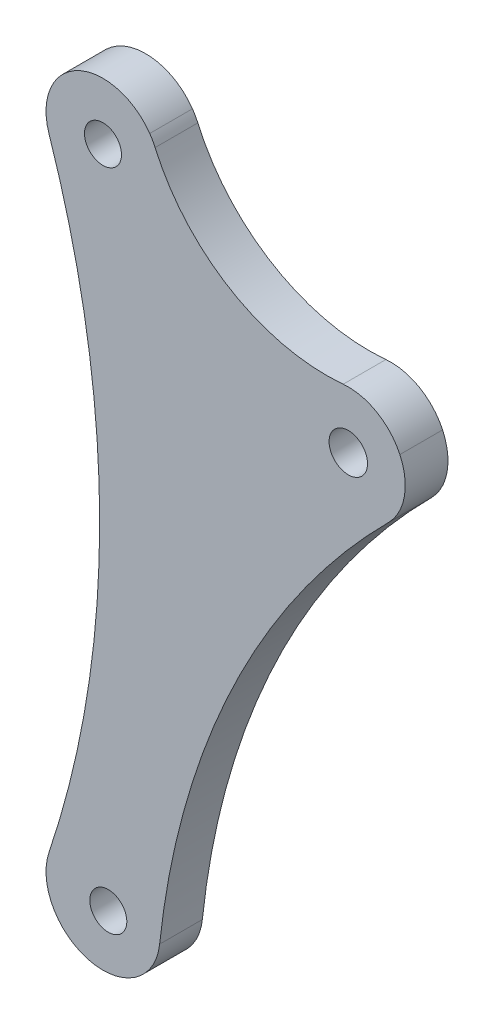
ISO-10303-21;
HEADER;
FILE_DESCRIPTION(('STEP AP214'),'2;1');
FILE_NAME('part.step','',(''),(''),'','','');
FILE_SCHEMA(('AUTOMOTIVE_DESIGN { 1 0 10303 214 1 1 1 1 }'));
ENDSEC;
DATA;
#1=APPLICATION_CONTEXT('core data for automotive mechanical design processes');
#2=APPLICATION_PROTOCOL_DEFINITION('international standard','automotive_design',2000,#1);
#3=PRODUCT_CONTEXT('',#1,'mechanical');
#4=PRODUCT('Part','Part','',(#3));
#5=PRODUCT_RELATED_PRODUCT_CATEGORY('part','',(#4));
#6=PRODUCT_DEFINITION_FORMATION('','',#4);
#7=PRODUCT_DEFINITION_CONTEXT('part definition',#1,'design');
#8=PRODUCT_DEFINITION('design','',#6,#7);
#9=PRODUCT_DEFINITION_SHAPE('','',#8);
#10=(LENGTH_UNIT() NAMED_UNIT(*) SI_UNIT(.MILLI.,.METRE.));
#11=(NAMED_UNIT(*) PLANE_ANGLE_UNIT() SI_UNIT($,.RADIAN.));
#12=(NAMED_UNIT(*) SI_UNIT($,.STERADIAN.) SOLID_ANGLE_UNIT());
#13=UNCERTAINTY_MEASURE_WITH_UNIT(LENGTH_MEASURE(1.E-05),#10,'distance_accuracy_value','');
#14=(GEOMETRIC_REPRESENTATION_CONTEXT(3) GLOBAL_UNCERTAINTY_ASSIGNED_CONTEXT((#13)) GLOBAL_UNIT_ASSIGNED_CONTEXT((#10,
#11,#12)) REPRESENTATION_CONTEXT('',''));
#15=CARTESIAN_POINT('',(0.,0.,0.));
#16=DIRECTION('',(0.,0.,1.));
#17=DIRECTION('',(1.,0.,0.));
#18=AXIS2_PLACEMENT_3D('',#15,#16,#17);
#19=CARTESIAN_POINT('',(-3.29500242135915,15.9735026125684,0.));
#20=DIRECTION('',(-0.948465419700004,-0.316880652033688,0.));
#21=DIRECTION('',(0.316880652033688,-0.948465419700004,0.));
#22=AXIS2_PLACEMENT_3D('',#19,#20,#21);
#23=PLANE('',#22);
#24=CARTESIAN_POINT('',(-3.31111584765589,16.0217322142726,3.));
#25=CARTESIAN_POINT('',(-3.30573861184361,16.0056571689623,3.));
#26=CARTESIAN_POINT('',(-3.30036746974364,15.9895806339352,3.));
#27=CARTESIAN_POINT('',(-3.29500242135915,15.9735026125684,3.));
#28=B_SPLINE_CURVE_WITH_KNOTS('',3,(#24,#25,#26,#27),.UNSPECIFIED.,.F.,.F.,(4,4),(0.,1.),.UNSPECIFIED.);
#29=CARTESIAN_POINT('',(-3.31111584765589,16.0217322142726,3.));
#30=VERTEX_POINT('',#29);
#31=CARTESIAN_POINT('',(-3.29500242135915,15.9735026125684,3.));
#32=VERTEX_POINT('',#31);
#33=EDGE_CURVE('E157',#30,#32,#28,.T.);
#34=ORIENTED_EDGE('',*,*,#33,.F.);
#35=DIRECTION('',(0.,0.,1.));
#36=VECTOR('',#35,1.);
#37=CARTESIAN_POINT('',(-3.31111584765589,16.0217322142726,0.));
#38=LINE('',#37,#36);
#39=CARTESIAN_POINT('',(-3.31111584765589,16.0217322142726,0.));
#40=VERTEX_POINT('',#39);
#41=EDGE_CURVE('E11',#40,#30,#38,.T.);
#42=ORIENTED_EDGE('',*,*,#41,.F.);
#43=CARTESIAN_POINT('',(-3.31111584765589,16.0217322142726,0.));
#44=CARTESIAN_POINT('',(-3.30573861184361,16.0056571689623,0.));
#45=CARTESIAN_POINT('',(-3.30036746974364,15.9895806339352,0.));
#46=CARTESIAN_POINT('',(-3.29500242135915,15.9735026125684,0.));
#47=B_SPLINE_CURVE_WITH_KNOTS('',3,(#43,#44,#45,#46),.UNSPECIFIED.,.F.,.F.,(4,4),(0.,1.),.UNSPECIFIED.);
#48=CARTESIAN_POINT('',(-3.29500242135915,15.9735026125684,0.));
#49=VERTEX_POINT('',#48);
#50=EDGE_CURVE('E195',#40,#49,#47,.T.);
#51=ORIENTED_EDGE('',*,*,#50,.T.);
#52=DIRECTION('',(0.,0.,1.));
#53=VECTOR('',#52,1.);
#54=CARTESIAN_POINT('',(-3.29500242135915,15.9735026125684,0.));
#55=LINE('',#54,#53);
#56=EDGE_CURVE('E39',#49,#32,#55,.T.);
#57=ORIENTED_EDGE('',*,*,#56,.T.);
#58=EDGE_LOOP('',(#34,#42,#51,#57));
#59=FACE_BOUND('',#58,.T.);
#60=ADVANCED_FACE('F36',(#59),#23,.T.);
#61=CARTESIAN_POINT('',(-3.3131158476559,16.0217322142726,0.));
#62=DIRECTION('',(0.,-1.,0.));
#63=DIRECTION('',(0.,0.,-1.));
#64=AXIS2_PLACEMENT_3D('',#61,#62,#63);
#65=PLANE('',#64);
#66=DIRECTION('',(1.,0.,0.));
#67=VECTOR('',#66,1.);
#68=CARTESIAN_POINT('',(-3.3131158476559,16.0217322142726,3.));
#69=LINE('',#68,#67);
#70=CARTESIAN_POINT('',(-3.3131158476559,16.0217322142726,3.));
#71=VERTEX_POINT('',#70);
#72=EDGE_CURVE('E193',#71,#30,#69,.T.);
#73=ORIENTED_EDGE('',*,*,#72,.F.);
#74=DIRECTION('',(0.,0.,1.));
#75=VECTOR('',#74,1.);
#76=CARTESIAN_POINT('',(-3.3131158476559,16.0217322142726,0.));
#77=LINE('',#76,#75);
#78=CARTESIAN_POINT('',(-3.3131158476559,16.0217322142726,0.));
#79=VERTEX_POINT('',#78);
#80=EDGE_CURVE('E45',#79,#71,#77,.T.);
#81=ORIENTED_EDGE('',*,*,#80,.F.);
#82=DIRECTION('',(1.,0.,0.));
#83=VECTOR('',#82,1.);
#84=CARTESIAN_POINT('',(-3.3131158476559,16.0217322142726,0.));
#85=LINE('',#84,#83);
#86=EDGE_CURVE('E147',#79,#40,#85,.T.);
#87=ORIENTED_EDGE('',*,*,#86,.T.);
#88=ORIENTED_EDGE('',*,*,#41,.T.);
#89=EDGE_LOOP('',(#73,#81,#87,#88));
#90=FACE_BOUND('',#89,.T.);
#91=ADVANCED_FACE('F215',(#90),#65,.T.);
#92=CARTESIAN_POINT('',(0.481093594531406,17.2907037764446,0.));
#93=DIRECTION('',(0.,0.,1.));
#94=DIRECTION('',(1.,0.,0.));
#95=AXIS2_PLACEMENT_3D('',#92,#93,#94);
#96=CYLINDRICAL_SURFACE('',#95,4.00078918674902);
#97=CARTESIAN_POINT('',(0.481093594531406,17.2907037764446,3.));
#98=DIRECTION('',(0.,0.,1.));
#99=DIRECTION('',(1.,0.,0.));
#100=AXIS2_PLACEMENT_3D('',#97,#98,#99);
#101=CIRCLE('',#100,4.00078918674902);
#102=CARTESIAN_POINT('',(3.76413819029268,19.577170985711,3.));
#103=VERTEX_POINT('',#102);
#104=EDGE_CURVE('E134',#103,#71,#101,.T.);
#105=ORIENTED_EDGE('',*,*,#104,.F.);
#106=DIRECTION('',(0.,0.,1.));
#107=VECTOR('',#106,1.);
#108=CARTESIAN_POINT('',(3.76413819029268,19.577170985711,0.));
#109=LINE('',#108,#107);
#110=CARTESIAN_POINT('',(3.76413819029268,19.577170985711,0.));
#111=VERTEX_POINT('',#110);
#112=EDGE_CURVE('E129',#111,#103,#109,.T.);
#113=ORIENTED_EDGE('',*,*,#112,.F.);
#114=CARTESIAN_POINT('',(0.481093594531406,17.2907037764446,0.));
#115=DIRECTION('',(0.,0.,1.));
#116=DIRECTION('',(1.,0.,0.));
#117=AXIS2_PLACEMENT_3D('',#114,#115,#116);
#118=CIRCLE('',#117,4.00078918674902);
#119=EDGE_CURVE('E132',#111,#79,#118,.T.);
#120=ORIENTED_EDGE('',*,*,#119,.T.);
#121=ORIENTED_EDGE('',*,*,#80,.T.);
#122=EDGE_LOOP('',(#105,#113,#120,#121));
#123=FACE_BOUND('',#122,.T.);
#124=ADVANCED_FACE('F131',(#123),#96,.T.);
#125=CARTESIAN_POINT('',(0.481176164601476,17.2907612821385,0.));
#126=DIRECTION('',(0.,0.,1.));
#127=DIRECTION('',(1.,0.,0.));
#128=AXIS2_PLACEMENT_3D('',#125,#126,#127);
#129=CYLINDRICAL_SURFACE('',#128,4.00068856507488);
#130=CARTESIAN_POINT('',(0.481176164601476,17.2907612821385,3.));
#131=DIRECTION('',(0.,0.,1.));
#132=DIRECTION('',(1.,0.,0.));
#133=AXIS2_PLACEMENT_3D('',#130,#131,#132);
#134=CIRCLE('',#133,4.00068856507488);
#135=CARTESIAN_POINT('',(4.14061788143285,18.9075467706419,3.));
#136=VERTEX_POINT('',#135);
#137=EDGE_CURVE('E190',#136,#103,#134,.T.);
#138=ORIENTED_EDGE('',*,*,#137,.F.);
#139=DIRECTION('',(0.,0.,1.));
#140=VECTOR('',#139,1.);
#141=CARTESIAN_POINT('',(4.14061788143285,18.9075467706419,0.));
#142=LINE('',#141,#140);
#143=CARTESIAN_POINT('',(4.14061788143285,18.9075467706419,0.));
#144=VERTEX_POINT('',#143);
#145=EDGE_CURVE('E139',#144,#136,#142,.T.);
#146=ORIENTED_EDGE('',*,*,#145,.F.);
#147=CARTESIAN_POINT('',(0.481176164601476,17.2907612821385,0.));
#148=DIRECTION('',(0.,0.,1.));
#149=DIRECTION('',(1.,0.,0.));
#150=AXIS2_PLACEMENT_3D('',#147,#148,#149);
#151=CIRCLE('',#150,4.00068856507488);
#152=EDGE_CURVE('E145',#144,#111,#151,.T.);
#153=ORIENTED_EDGE('',*,*,#152,.T.);
#154=ORIENTED_EDGE('',*,*,#112,.T.);
#155=EDGE_LOOP('',(#138,#146,#153,#154));
#156=FACE_BOUND('',#155,.T.);
#157=ADVANCED_FACE('F149',(#156),#129,.T.);
#158=CARTESIAN_POINT('',(16.1693336867396,24.2147792740366,0.));
#159=DIRECTION('',(0.,0.,1.));
#160=DIRECTION('',(1.,0.,0.));
#161=AXIS2_PLACEMENT_3D('',#158,#159,#160);
#162=CYLINDRICAL_SURFACE('',#161,13.1474986506941);
#163=CARTESIAN_POINT('',(16.1693336867396,24.2147792740366,3.));
#164=DIRECTION('',(0.,0.,-1.));
#165=DIRECTION('',(-1.,0.,0.));
#166=AXIS2_PLACEMENT_3D('',#163,#164,#165);
#167=CIRCLE('',#166,13.1474986506941);
#168=CARTESIAN_POINT('',(17.3516178814302,11.1205467706407,3.));
#169=VERTEX_POINT('',#168);
#170=EDGE_CURVE('E187',#169,#136,#167,.T.);
#171=ORIENTED_EDGE('',*,*,#170,.F.);
#172=DIRECTION('',(0.,0.,1.));
#173=VECTOR('',#172,1.);
#174=CARTESIAN_POINT('',(17.3516178814302,11.1205467706407,0.));
#175=LINE('',#174,#173);
#176=CARTESIAN_POINT('',(17.3516178814302,11.1205467706407,0.));
#177=VERTEX_POINT('',#176);
#178=EDGE_CURVE('E199',#177,#169,#175,.T.);
#179=ORIENTED_EDGE('',*,*,#178,.F.);
#180=CARTESIAN_POINT('',(16.1693336867396,24.2147792740366,0.));
#181=DIRECTION('',(0.,0.,-1.));
#182=DIRECTION('',(-1.,0.,0.));
#183=AXIS2_PLACEMENT_3D('',#180,#181,#182);
#184=CIRCLE('',#183,13.1474986506941);
#185=EDGE_CURVE('E150',#177,#144,#184,.T.);
#186=ORIENTED_EDGE('',*,*,#185,.T.);
#187=ORIENTED_EDGE('',*,*,#145,.T.);
#188=EDGE_LOOP('',(#171,#179,#186,#187));
#189=FACE_BOUND('',#188,.T.);
#190=ADVANCED_FACE('F228',(#189),#162,.F.);
#191=CARTESIAN_POINT('',(17.7088333436635,7.13313329625842,0.));
#192=DIRECTION('',(0.,0.,1.));
#193=DIRECTION('',(1.,0.,0.));
#194=AXIS2_PLACEMENT_3D('',#191,#192,#193);
#195=CYLINDRICAL_SURFACE('',#194,4.00338220785177);
#196=CARTESIAN_POINT('',(17.7088333436635,7.13313329625842,3.));
#197=DIRECTION('',(0.,0.,1.));
#198=DIRECTION('',(1.,0.,0.));
#199=AXIS2_PLACEMENT_3D('',#196,#197,#198);
#200=CIRCLE('',#199,4.00338220785177);
#201=CARTESIAN_POINT('',(21.3336178814302,8.8325467706407,3.));
#202=VERTEX_POINT('',#201);
#203=EDGE_CURVE('E184',#202,#169,#200,.T.);
#204=ORIENTED_EDGE('',*,*,#203,.F.);
#205=DIRECTION('',(0.,0.,1.));
#206=VECTOR('',#205,1.);
#207=CARTESIAN_POINT('',(21.3336178814302,8.8325467706407,0.));
#208=LINE('',#207,#206);
#209=CARTESIAN_POINT('',(21.3336178814302,8.8325467706407,0.));
#210=VERTEX_POINT('',#209);
#211=EDGE_CURVE('E201',#210,#202,#208,.T.);
#212=ORIENTED_EDGE('',*,*,#211,.F.);
#213=CARTESIAN_POINT('',(17.7088333436635,7.13313329625842,0.));
#214=DIRECTION('',(0.,0.,1.));
#215=DIRECTION('',(1.,0.,0.));
#216=AXIS2_PLACEMENT_3D('',#213,#214,#215);
#217=CIRCLE('',#216,4.00338220785177);
#218=EDGE_CURVE('E152',#210,#177,#217,.T.);
#219=ORIENTED_EDGE('',*,*,#218,.T.);
#220=ORIENTED_EDGE('',*,*,#178,.T.);
#221=EDGE_LOOP('',(#204,#212,#219,#220));
#222=FACE_BOUND('',#221,.T.);
#223=ADVANCED_FACE('F231',(#222),#195,.T.);
#224=CARTESIAN_POINT('',(17.7094826601012,7.13568317569735,0.));
#225=DIRECTION('',(0.,0.,1.));
#226=DIRECTION('',(1.,0.,0.));
#227=AXIS2_PLACEMENT_3D('',#224,#225,#226);
#228=CYLINDRICAL_SURFACE('',#227,4.00171240374934);
#229=CARTESIAN_POINT('',(17.7094826601012,7.13568317569735,3.));
#230=DIRECTION('',(0.,0.,1.));
#231=DIRECTION('',(1.,0.,0.));
#232=AXIS2_PLACEMENT_3D('',#229,#230,#231);
#233=CIRCLE('',#232,4.00171240374934);
#234=CARTESIAN_POINT('',(20.5426178814302,4.30954677064071,3.));
#235=VERTEX_POINT('',#234);
#236=EDGE_CURVE('E181',#235,#202,#233,.T.);
#237=ORIENTED_EDGE('',*,*,#236,.F.);
#238=DIRECTION('',(0.,0.,1.));
#239=VECTOR('',#238,1.);
#240=CARTESIAN_POINT('',(20.5426178814302,4.30954677064071,0.));
#241=LINE('',#240,#239);
#242=CARTESIAN_POINT('',(20.5426178814302,4.30954677064071,0.));
#243=VERTEX_POINT('',#242);
#244=EDGE_CURVE('E203',#243,#235,#241,.T.);
#245=ORIENTED_EDGE('',*,*,#244,.F.);
#246=CARTESIAN_POINT('',(17.7094826601012,7.13568317569735,0.));
#247=DIRECTION('',(0.,0.,1.));
#248=DIRECTION('',(1.,0.,0.));
#249=AXIS2_PLACEMENT_3D('',#246,#247,#248);
#250=CIRCLE('',#249,4.00171240374934);
#251=EDGE_CURVE('E320',#243,#210,#250,.T.);
#252=ORIENTED_EDGE('',*,*,#251,.T.);
#253=ORIENTED_EDGE('',*,*,#211,.T.);
#254=EDGE_LOOP('',(#237,#245,#252,#253));
#255=FACE_BOUND('',#254,.T.);
#256=ADVANCED_FACE('F235',(#255),#228,.T.);
#257=CARTESIAN_POINT('',(60.2319217528376,-35.3195977493679,0.));
#258=DIRECTION('',(0.,0.,1.));
#259=DIRECTION('',(1.,0.,0.));
#260=AXIS2_PLACEMENT_3D('',#257,#258,#259);
#261=CYLINDRICAL_SURFACE('',#260,56.0866288627214);
#262=CARTESIAN_POINT('',(60.2319217528376,-35.3195977493679,3.));
#263=DIRECTION('',(0.,0.,-1.));
#264=DIRECTION('',(-1.,0.,0.));
#265=AXIS2_PLACEMENT_3D('',#262,#263,#264);
#266=CIRCLE('',#265,56.0866288627214);
#267=CARTESIAN_POINT('',(4.45991135063528,-29.3872463705905,3.));
#268=VERTEX_POINT('',#267);
#269=EDGE_CURVE('E178',#268,#235,#266,.T.);
#270=ORIENTED_EDGE('',*,*,#269,.F.);
#271=DIRECTION('',(0.,0.,1.));
#272=VECTOR('',#271,1.);
#273=CARTESIAN_POINT('',(4.45991135063528,-29.3872463705905,0.));
#274=LINE('',#273,#272);
#275=CARTESIAN_POINT('',(4.45991135063528,-29.3872463705905,0.));
#276=VERTEX_POINT('',#275);
#277=EDGE_CURVE('E205',#276,#268,#274,.T.);
#278=ORIENTED_EDGE('',*,*,#277,.F.);
#279=CARTESIAN_POINT('',(60.2319217528376,-35.3195977493679,0.));
#280=DIRECTION('',(0.,0.,-1.));
#281=DIRECTION('',(-1.,0.,0.));
#282=AXIS2_PLACEMENT_3D('',#279,#280,#281);
#283=CIRCLE('',#282,56.0866288627214);
#284=EDGE_CURVE('E317',#276,#243,#283,.T.);
#285=ORIENTED_EDGE('',*,*,#284,.T.);
#286=ORIENTED_EDGE('',*,*,#244,.T.);
#287=EDGE_LOOP('',(#270,#278,#285,#286));
#288=FACE_BOUND('',#287,.T.);
#289=ADVANCED_FACE('F239',(#288),#261,.F.);
#290=CARTESIAN_POINT('',(0.482783928185402,-28.9615086912394,0.));
#291=DIRECTION('',(0.,0.,1.));
#292=DIRECTION('',(1.,0.,0.));
#293=AXIS2_PLACEMENT_3D('',#290,#291,#292);
#294=CYLINDRICAL_SURFACE('',#293,3.99984938541716);
#295=CARTESIAN_POINT('',(0.482783928185402,-28.9615086912394,3.));
#296=DIRECTION('',(0.,0.,1.));
#297=DIRECTION('',(1.,0.,0.));
#298=AXIS2_PLACEMENT_3D('',#295,#296,#297);
#299=CIRCLE('',#298,3.99984938541716);
#300=CARTESIAN_POINT('',(1.83391135063529,-32.7262463705905,3.));
#301=VERTEX_POINT('',#300);
#302=EDGE_CURVE('E175',#301,#268,#299,.T.);
#303=ORIENTED_EDGE('',*,*,#302,.F.);
#304=DIRECTION('',(0.,0.,1.));
#305=VECTOR('',#304,1.);
#306=CARTESIAN_POINT('',(1.83391135063529,-32.7262463705905,0.));
#307=LINE('',#306,#305);
#308=CARTESIAN_POINT('',(1.83391135063529,-32.7262463705905,0.));
#309=VERTEX_POINT('',#308);
#310=EDGE_CURVE('E207',#309,#301,#307,.T.);
#311=ORIENTED_EDGE('',*,*,#310,.F.);
#312=CARTESIAN_POINT('',(0.482783928185402,-28.9615086912394,0.));
#313=DIRECTION('',(0.,0.,1.));
#314=DIRECTION('',(1.,0.,0.));
#315=AXIS2_PLACEMENT_3D('',#312,#313,#314);
#316=CIRCLE('',#315,3.99984938541716);
#317=EDGE_CURVE('E314',#309,#276,#316,.T.);
#318=ORIENTED_EDGE('',*,*,#317,.T.);
#319=ORIENTED_EDGE('',*,*,#277,.T.);
#320=EDGE_LOOP('',(#303,#311,#318,#319));
#321=FACE_BOUND('',#320,.T.);
#322=ADVANCED_FACE('F243',(#321),#294,.T.);
#323=CARTESIAN_POINT('',(0.479967852834814,-28.9640166611491,0.));
#324=DIRECTION('',(0.,0.,1.));
#325=DIRECTION('',(1.,0.,0.));
#326=AXIS2_PLACEMENT_3D('',#323,#324,#325);
#327=CYLINDRICAL_SURFACE('',#326,3.99844161916074);
#328=CARTESIAN_POINT('',(0.479967852834814,-28.9640166611491,3.));
#329=DIRECTION('',(0.,0.,1.));
#330=DIRECTION('',(1.,0.,0.));
#331=AXIS2_PLACEMENT_3D('',#328,#329,#330);
#332=CIRCLE('',#331,3.99844161916074);
#333=CARTESIAN_POINT('',(-2.66155055058806,-31.4375561297633,3.));
#334=VERTEX_POINT('',#333);
#335=EDGE_CURVE('E172',#334,#301,#332,.T.);
#336=ORIENTED_EDGE('',*,*,#335,.F.);
#337=DIRECTION('',(0.,0.,1.));
#338=VECTOR('',#337,1.);
#339=CARTESIAN_POINT('',(-2.66155055058806,-31.4375561297633,0.));
#340=LINE('',#339,#338);
#341=CARTESIAN_POINT('',(-2.66155055058806,-31.4375561297633,0.));
#342=VERTEX_POINT('',#341);
#343=EDGE_CURVE('E209',#342,#334,#340,.T.);
#344=ORIENTED_EDGE('',*,*,#343,.F.);
#345=CARTESIAN_POINT('',(0.479967852834814,-28.9640166611491,0.));
#346=DIRECTION('',(0.,0.,1.));
#347=DIRECTION('',(1.,0.,0.));
#348=AXIS2_PLACEMENT_3D('',#345,#346,#347);
#349=CIRCLE('',#348,3.99844161916074);
#350=EDGE_CURVE('E311',#342,#309,#349,.T.);
#351=ORIENTED_EDGE('',*,*,#350,.T.);
#352=ORIENTED_EDGE('',*,*,#310,.T.);
#353=EDGE_LOOP('',(#336,#344,#351,#352));
#354=FACE_BOUND('',#353,.T.);
#355=ADVANCED_FACE('F247',(#354),#327,.T.);
#356=CARTESIAN_POINT('',(0.483179432059044,-28.9614879578447,0.));
#357=DIRECTION('',(0.,0.,1.));
#358=DIRECTION('',(1.,0.,0.));
#359=AXIS2_PLACEMENT_3D('',#356,#357,#358);
#360=CYLINDRICAL_SURFACE('',#359,4.00252923234147);
#361=CARTESIAN_POINT('',(0.483179432059044,-28.9614879578447,3.));
#362=DIRECTION('',(0.,0.,1.));
#363=DIRECTION('',(1.,0.,0.));
#364=AXIS2_PLACEMENT_3D('',#361,#362,#363);
#365=CIRCLE('',#364,4.00252923234147);
#366=CARTESIAN_POINT('',(-3.31311584765553,-27.6932677857275,3.));
#367=VERTEX_POINT('',#366);
#368=EDGE_CURVE('E169',#367,#334,#365,.T.);
#369=ORIENTED_EDGE('',*,*,#368,.F.);
#370=DIRECTION('',(0.,0.,1.));
#371=VECTOR('',#370,1.);
#372=CARTESIAN_POINT('',(-3.31311584765553,-27.6932677857275,0.));
#373=LINE('',#372,#371);
#374=CARTESIAN_POINT('',(-3.31311584765553,-27.6932677857275,0.));
#375=VERTEX_POINT('',#374);
#376=EDGE_CURVE('E210',#375,#367,#373,.T.);
#377=ORIENTED_EDGE('',*,*,#376,.F.);
#378=CARTESIAN_POINT('',(0.483179432059044,-28.9614879578447,0.));
#379=DIRECTION('',(0.,0.,1.));
#380=DIRECTION('',(1.,0.,0.));
#381=AXIS2_PLACEMENT_3D('',#378,#379,#380);
#382=CIRCLE('',#381,4.00252923234147);
#383=EDGE_CURVE('E308',#375,#342,#382,.T.);
#384=ORIENTED_EDGE('',*,*,#383,.T.);
#385=ORIENTED_EDGE('',*,*,#343,.T.);
#386=EDGE_LOOP('',(#369,#377,#384,#385));
#387=FACE_BOUND('',#386,.T.);
#388=ADVANCED_FACE('F251',(#387),#360,.T.);
#389=CARTESIAN_POINT('',(-68.641290961632,-5.83278002959304,0.));
#390=DIRECTION('',(0.,0.,1.));
#391=DIRECTION('',(1.,0.,0.));
#392=AXIS2_PLACEMENT_3D('',#389,#390,#391);
#393=CYLINDRICAL_SURFACE('',#392,68.8886883940928);
#394=CARTESIAN_POINT('',(-68.641290961632,-5.83278002959304,3.));
#395=DIRECTION('',(0.,0.,-1.));
#396=DIRECTION('',(-1.,0.,0.));
#397=AXIS2_PLACEMENT_3D('',#394,#395,#396);
#398=CIRCLE('',#397,68.8886883940928);
#399=EDGE_CURVE('E162',#32,#367,#398,.T.);
#400=ORIENTED_EDGE('',*,*,#399,.F.);
#401=ORIENTED_EDGE('',*,*,#56,.F.);
#402=CARTESIAN_POINT('',(-68.641290961632,-5.83278002959304,0.));
#403=DIRECTION('',(0.,0.,-1.));
#404=DIRECTION('',(-1.,0.,0.));
#405=AXIS2_PLACEMENT_3D('',#402,#403,#404);
#406=CIRCLE('',#405,68.8886883940928);
#407=EDGE_CURVE('E303',#49,#375,#406,.T.);
#408=ORIENTED_EDGE('',*,*,#407,.T.);
#409=ORIENTED_EDGE('',*,*,#376,.T.);
#410=EDGE_LOOP('',(#400,#401,#408,#409));
#411=FACE_BOUND('',#410,.T.);
#412=ADVANCED_FACE('F212',(#411),#393,.F.);
#413=CARTESIAN_POINT('',(-3.30305456422209,15.9976185294417,0.));
#414=DIRECTION('',(0.,0.,1.));
#415=DIRECTION('',(1.,0.,0.));
#416=AXIS2_PLACEMENT_3D('',#413,#414,#415);
#417=PLANE('',#416);
#418=CARTESIAN_POINT('',(17.7113841523441,7.13623221427256,0.));
#419=DIRECTION('',(0.,0.,1.));
#420=DIRECTION('',(-1.,0.,0.));
#421=AXIS2_PLACEMENT_3D('',#418,#419,#420);
#422=CIRCLE('',#421,1.35);
#423=CARTESIAN_POINT('',(16.3613841523441,7.13623221427256,0.));
#424=VERTEX_POINT('',#423);
#425=EDGE_CURVE('E282',#424,#424,#422,.T.);
#426=ORIENTED_EDGE('',*,*,#425,.T.);
#427=EDGE_LOOP('',(#426));
#428=FACE_BOUND('',#427,.T.);
#429=CARTESIAN_POINT('',(0.480884152344096,17.2912322142726,0.));
#430=DIRECTION('',(0.,0.,1.));
#431=DIRECTION('',(-1.,0.,0.));
#432=AXIS2_PLACEMENT_3D('',#429,#430,#431);
#433=CIRCLE('',#432,1.3);
#434=CARTESIAN_POINT('',(-0.819115847655904,17.2912322142726,0.));
#435=VERTEX_POINT('',#434);
#436=EDGE_CURVE('E290',#435,#435,#433,.T.);
#437=ORIENTED_EDGE('',*,*,#436,.T.);
#438=EDGE_LOOP('',(#437));
#439=FACE_BOUND('',#438,.T.);
#440=CARTESIAN_POINT('',(0.853283407169475,-29.1662369573477,0.));
#441=DIRECTION('',(0.,0.,1.));
#442=DIRECTION('',(-1.,0.,0.));
#443=AXIS2_PLACEMENT_3D('',#440,#441,#442);
#444=CIRCLE('',#443,1.3);
#445=CARTESIAN_POINT('',(-0.446716592830525,-29.1662369573477,0.));
#446=VERTEX_POINT('',#445);
#447=EDGE_CURVE('E163',#446,#446,#444,.T.);
#448=ORIENTED_EDGE('',*,*,#447,.T.);
#449=EDGE_LOOP('',(#448));
#450=FACE_BOUND('',#449,.T.);
#451=ORIENTED_EDGE('',*,*,#50,.F.);
#452=ORIENTED_EDGE('',*,*,#86,.F.);
#453=ORIENTED_EDGE('',*,*,#119,.F.);
#454=ORIENTED_EDGE('',*,*,#152,.F.);
#455=ORIENTED_EDGE('',*,*,#185,.F.);
#456=ORIENTED_EDGE('',*,*,#218,.F.);
#457=ORIENTED_EDGE('',*,*,#251,.F.);
#458=ORIENTED_EDGE('',*,*,#284,.F.);
#459=ORIENTED_EDGE('',*,*,#317,.F.);
#460=ORIENTED_EDGE('',*,*,#350,.F.);
#461=ORIENTED_EDGE('',*,*,#383,.F.);
#462=ORIENTED_EDGE('',*,*,#407,.F.);
#463=EDGE_LOOP('',(#451,#452,#453,#454,#455,#456,#457,#458,#459,#460,#461,#462));
#464=FACE_BOUND('',#463,.T.);
#465=ADVANCED_FACE('F143',(#428,#439,#450,#464),#417,.F.);
#466=CARTESIAN_POINT('',(-3.30305456422209,15.9976185294417,3.));
#467=DIRECTION('',(0.,0.,1.));
#468=DIRECTION('',(1.,0.,0.));
#469=AXIS2_PLACEMENT_3D('',#466,#467,#468);
#470=PLANE('',#469);
#471=CARTESIAN_POINT('',(17.7113841523441,7.13623221427256,3.));
#472=DIRECTION('',(0.,0.,1.));
#473=DIRECTION('',(-1.,0.,0.));
#474=AXIS2_PLACEMENT_3D('',#471,#472,#473);
#475=CIRCLE('',#474,1.35);
#476=CARTESIAN_POINT('',(16.3613841523441,7.13623221427256,3.));
#477=VERTEX_POINT('',#476);
#478=EDGE_CURVE('E285',#477,#477,#475,.T.);
#479=ORIENTED_EDGE('',*,*,#478,.F.);
#480=EDGE_LOOP('',(#479));
#481=FACE_BOUND('',#480,.T.);
#482=CARTESIAN_POINT('',(0.480884152344096,17.2912322142726,3.));
#483=DIRECTION('',(0.,0.,1.));
#484=DIRECTION('',(-1.,0.,0.));
#485=AXIS2_PLACEMENT_3D('',#482,#483,#484);
#486=CIRCLE('',#485,1.3);
#487=CARTESIAN_POINT('',(-0.819115847655904,17.2912322142726,3.));
#488=VERTEX_POINT('',#487);
#489=EDGE_CURVE('E287',#488,#488,#486,.T.);
#490=ORIENTED_EDGE('',*,*,#489,.F.);
#491=EDGE_LOOP('',(#490));
#492=FACE_BOUND('',#491,.T.);
#493=CARTESIAN_POINT('',(0.853283407169475,-29.1662369573477,3.));
#494=DIRECTION('',(0.,0.,1.));
#495=DIRECTION('',(-1.,0.,0.));
#496=AXIS2_PLACEMENT_3D('',#493,#494,#495);
#497=CIRCLE('',#496,1.3);
#498=CARTESIAN_POINT('',(-0.446716592830525,-29.1662369573477,3.));
#499=VERTEX_POINT('',#498);
#500=EDGE_CURVE('E293',#499,#499,#497,.T.);
#501=ORIENTED_EDGE('',*,*,#500,.F.);
#502=EDGE_LOOP('',(#501));
#503=FACE_BOUND('',#502,.T.);
#504=ORIENTED_EDGE('',*,*,#33,.T.);
#505=ORIENTED_EDGE('',*,*,#399,.T.);
#506=ORIENTED_EDGE('',*,*,#368,.T.);
#507=ORIENTED_EDGE('',*,*,#335,.T.);
#508=ORIENTED_EDGE('',*,*,#302,.T.);
#509=ORIENTED_EDGE('',*,*,#269,.T.);
#510=ORIENTED_EDGE('',*,*,#236,.T.);
#511=ORIENTED_EDGE('',*,*,#203,.T.);
#512=ORIENTED_EDGE('',*,*,#170,.T.);
#513=ORIENTED_EDGE('',*,*,#137,.T.);
#514=ORIENTED_EDGE('',*,*,#104,.T.);
#515=ORIENTED_EDGE('',*,*,#72,.T.);
#516=EDGE_LOOP('',(#504,#505,#506,#507,#508,#509,#510,#511,#512,#513,#514,#515));
#517=FACE_BOUND('',#516,.T.);
#518=ADVANCED_FACE('F214',(#481,#492,#503,#517),#470,.T.);
#519=CARTESIAN_POINT('',(0.853283407169475,-29.1662369573477,0.));
#520=DIRECTION('',(0.,0.,1.));
#521=DIRECTION('',(1.,0.,0.));
#522=AXIS2_PLACEMENT_3D('',#519,#520,#521);
#523=CYLINDRICAL_SURFACE('',#522,1.3);
#524=ORIENTED_EDGE('',*,*,#447,.F.);
#525=EDGE_LOOP('',(#524));
#526=FACE_BOUND('',#525,.T.);
#527=ORIENTED_EDGE('',*,*,#500,.T.);
#528=EDGE_LOOP('',(#527));
#529=FACE_BOUND('',#528,.T.);
#530=ADVANCED_FACE('F263',(#526,#529),#523,.F.);
#531=CARTESIAN_POINT('',(0.480884152344096,17.2912322142726,0.));
#532=DIRECTION('',(0.,0.,1.));
#533=DIRECTION('',(1.,0.,0.));
#534=AXIS2_PLACEMENT_3D('',#531,#532,#533);
#535=CYLINDRICAL_SURFACE('',#534,1.3);
#536=ORIENTED_EDGE('',*,*,#436,.F.);
#537=EDGE_LOOP('',(#536));
#538=FACE_BOUND('',#537,.T.);
#539=ORIENTED_EDGE('',*,*,#489,.T.);
#540=EDGE_LOOP('',(#539));
#541=FACE_BOUND('',#540,.T.);
#542=ADVANCED_FACE('F270',(#538,#541),#535,.F.);
#543=CARTESIAN_POINT('',(17.7113841523441,7.13623221427256,0.));
#544=DIRECTION('',(0.,0.,1.));
#545=DIRECTION('',(1.,0.,0.));
#546=AXIS2_PLACEMENT_3D('',#543,#544,#545);
#547=CYLINDRICAL_SURFACE('',#546,1.35);
#548=ORIENTED_EDGE('',*,*,#425,.F.);
#549=EDGE_LOOP('',(#548));
#550=FACE_BOUND('',#549,.T.);
#551=ORIENTED_EDGE('',*,*,#478,.T.);
#552=EDGE_LOOP('',(#551));
#553=FACE_BOUND('',#552,.T.);
#554=ADVANCED_FACE('F274',(#550,#553),#547,.F.);
#555=CLOSED_SHELL('',(#60,#91,#124,#157,#190,#223,#256,#289,#322,#355,#388,#412,#465,#518,#530,
#542,#554));
#556=MANIFOLD_SOLID_BREP('B2',#555);
#557=ADVANCED_BREP_SHAPE_REPRESENTATION('',(#18,#556),#14);
#558=SHAPE_DEFINITION_REPRESENTATION(#9,#557);
ENDSEC;
END-ISO-10303-21;
